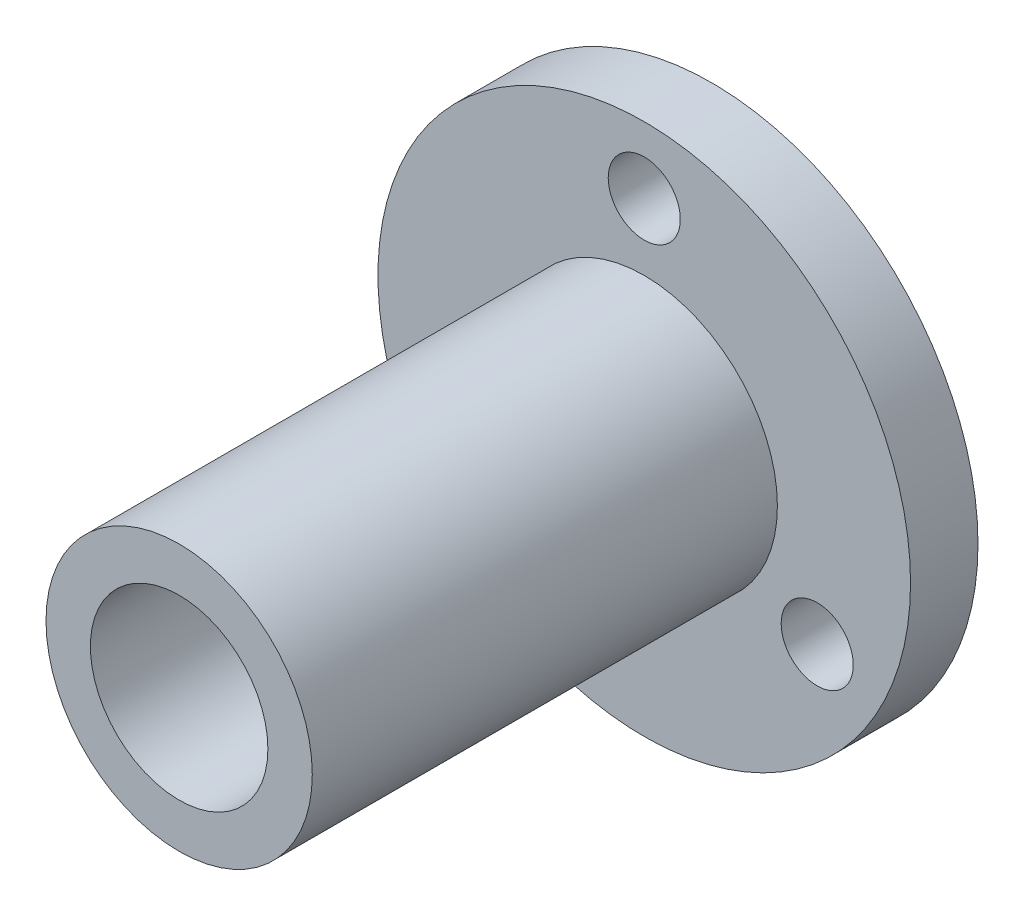
ISO-10303-21;
HEADER;
FILE_DESCRIPTION(('STEP AP214'),'2;1');
FILE_NAME('part.step','',(''),(''),'','','');
FILE_SCHEMA(('AUTOMOTIVE_DESIGN { 1 0 10303 214 1 1 1 1 }'));
ENDSEC;
DATA;
#1=APPLICATION_CONTEXT('core data for automotive mechanical design processes');
#2=APPLICATION_PROTOCOL_DEFINITION('international standard','automotive_design',2000,#1);
#3=PRODUCT_CONTEXT('',#1,'mechanical');
#4=PRODUCT('Part','Part','',(#3));
#5=PRODUCT_RELATED_PRODUCT_CATEGORY('part','',(#4));
#6=PRODUCT_DEFINITION_FORMATION('','',#4);
#7=PRODUCT_DEFINITION_CONTEXT('part definition',#1,'design');
#8=PRODUCT_DEFINITION('design','',#6,#7);
#9=PRODUCT_DEFINITION_SHAPE('','',#8);
#10=(LENGTH_UNIT() NAMED_UNIT(*) SI_UNIT(.MILLI.,.METRE.));
#11=(NAMED_UNIT(*) PLANE_ANGLE_UNIT() SI_UNIT($,.RADIAN.));
#12=(NAMED_UNIT(*) SI_UNIT($,.STERADIAN.) SOLID_ANGLE_UNIT());
#13=UNCERTAINTY_MEASURE_WITH_UNIT(LENGTH_MEASURE(1.E-05),#10,'distance_accuracy_value','');
#14=(GEOMETRIC_REPRESENTATION_CONTEXT(3) GLOBAL_UNCERTAINTY_ASSIGNED_CONTEXT((#13)) GLOBAL_UNIT_ASSIGNED_CONTEXT((#10,
#11,#12)) REPRESENTATION_CONTEXT('',''));
#15=CARTESIAN_POINT('',(0.,0.,0.));
#16=DIRECTION('',(0.,0.,1.));
#17=DIRECTION('',(1.,0.,0.));
#18=AXIS2_PLACEMENT_3D('',#15,#16,#17);
#19=CARTESIAN_POINT('',(0.,0.,0.));
#20=DIRECTION('',(0.,0.,1.));
#21=DIRECTION('',(1.,0.,0.));
#22=AXIS2_PLACEMENT_3D('',#19,#20,#21);
#23=PLANE('',#22);
#24=CARTESIAN_POINT('',(0.,0.,0.));
#25=DIRECTION('',(0.,0.,1.));
#26=DIRECTION('',(1.,0.,0.));
#27=AXIS2_PLACEMENT_3D('',#24,#25,#26);
#28=CIRCLE('',#27,6.35);
#29=CARTESIAN_POINT('',(6.35,0.,0.));
#30=VERTEX_POINT('',#29);
#31=EDGE_CURVE('E17',#30,#30,#28,.T.);
#32=ORIENTED_EDGE('',*,*,#31,.T.);
#33=EDGE_LOOP('',(#32));
#34=FACE_BOUND('',#33,.T.);
#35=CARTESIAN_POINT('',(12.3733379565702,-7.14375,0.));
#36=DIRECTION('',(0.,0.,-1.));
#37=DIRECTION('',(-1.,0.,0.));
#38=AXIS2_PLACEMENT_3D('',#35,#36,#37);
#39=CIRCLE('',#38,2.5781);
#40=CARTESIAN_POINT('',(9.79523795657016,-7.14375,0.));
#41=VERTEX_POINT('',#40);
#42=EDGE_CURVE('E43',#41,#41,#39,.F.);
#43=ORIENTED_EDGE('',*,*,#42,.T.);
#44=EDGE_LOOP('',(#43));
#45=FACE_BOUND('',#44,.T.);
#46=CARTESIAN_POINT('',(-12.3733379565702,-7.14375,0.));
#47=DIRECTION('',(0.,0.,-1.));
#48=DIRECTION('',(-1.,0.,0.));
#49=AXIS2_PLACEMENT_3D('',#46,#47,#48);
#50=CIRCLE('',#49,2.5781);
#51=CARTESIAN_POINT('',(-14.9514379565702,-7.14375,0.));
#52=VERTEX_POINT('',#51);
#53=EDGE_CURVE('E46',#52,#52,#50,.F.);
#54=ORIENTED_EDGE('',*,*,#53,.T.);
#55=EDGE_LOOP('',(#54));
#56=FACE_BOUND('',#55,.T.);
#57=CARTESIAN_POINT('',(0.,14.2875,0.));
#58=DIRECTION('',(0.,0.,-1.));
#59=DIRECTION('',(-1.,0.,0.));
#60=AXIS2_PLACEMENT_3D('',#57,#58,#59);
#61=CIRCLE('',#60,2.5781);
#62=CARTESIAN_POINT('',(-2.5781,14.2875,0.));
#63=VERTEX_POINT('',#62);
#64=EDGE_CURVE('E49',#63,#63,#61,.F.);
#65=ORIENTED_EDGE('',*,*,#64,.T.);
#66=EDGE_LOOP('',(#65));
#67=FACE_BOUND('',#66,.T.);
#68=CARTESIAN_POINT('',(0.,0.,0.));
#69=DIRECTION('',(0.,0.,1.));
#70=DIRECTION('',(1.,0.,0.));
#71=AXIS2_PLACEMENT_3D('',#68,#69,#70);
#72=CIRCLE('',#71,19.05);
#73=CARTESIAN_POINT('',(19.05,0.,0.));
#74=VERTEX_POINT('',#73);
#75=EDGE_CURVE('E51',#74,#74,#72,.T.);
#76=ORIENTED_EDGE('',*,*,#75,.F.);
#77=EDGE_LOOP('',(#76));
#78=FACE_BOUND('',#77,.T.);
#79=ADVANCED_FACE('F14',(#34,#45,#56,#67,#78),#23,.F.);
#80=CARTESIAN_POINT('',(0.,0.,38.1));
#81=DIRECTION('',(0.,0.,1.));
#82=DIRECTION('',(1.,0.,0.));
#83=AXIS2_PLACEMENT_3D('',#80,#81,#82);
#84=CYLINDRICAL_SURFACE('',#83,6.35);
#85=CARTESIAN_POINT('',(0.,0.,38.1));
#86=DIRECTION('',(0.,0.,1.));
#87=DIRECTION('',(1.,0.,0.));
#88=AXIS2_PLACEMENT_3D('',#85,#86,#87);
#89=CIRCLE('',#88,6.35);
#90=CARTESIAN_POINT('',(6.35,0.,38.1));
#91=VERTEX_POINT('',#90);
#92=EDGE_CURVE('E40',#91,#91,#89,.F.);
#93=ORIENTED_EDGE('',*,*,#92,.F.);
#94=EDGE_LOOP('',(#93));
#95=FACE_BOUND('',#94,.T.);
#96=ORIENTED_EDGE('',*,*,#31,.F.);
#97=EDGE_LOOP('',(#96));
#98=FACE_BOUND('',#97,.T.);
#99=ADVANCED_FACE('F60',(#95,#98),#84,.F.);
#100=CARTESIAN_POINT('',(0.,0.,0.));
#101=DIRECTION('',(0.,0.,1.));
#102=DIRECTION('',(1.,0.,0.));
#103=AXIS2_PLACEMENT_3D('',#100,#101,#102);
#104=CYLINDRICAL_SURFACE('',#103,19.05);
#105=CARTESIAN_POINT('',(0.,0.,4.826));
#106=DIRECTION('',(0.,0.,1.));
#107=DIRECTION('',(1.,0.,0.));
#108=AXIS2_PLACEMENT_3D('',#105,#106,#107);
#109=CIRCLE('',#108,19.05);
#110=CARTESIAN_POINT('',(19.05,0.,4.826));
#111=VERTEX_POINT('',#110);
#112=EDGE_CURVE('E37',#111,#111,#109,.T.);
#113=ORIENTED_EDGE('',*,*,#112,.F.);
#114=EDGE_LOOP('',(#113));
#115=FACE_BOUND('',#114,.T.);
#116=ORIENTED_EDGE('',*,*,#75,.T.);
#117=EDGE_LOOP('',(#116));
#118=FACE_BOUND('',#117,.T.);
#119=ADVANCED_FACE('F62',(#115,#118),#104,.T.);
#120=CARTESIAN_POINT('',(0.,14.2875,0.));
#121=DIRECTION('',(0.,0.,-1.));
#122=DIRECTION('',(-1.,0.,0.));
#123=AXIS2_PLACEMENT_3D('',#120,#121,#122);
#124=CYLINDRICAL_SURFACE('',#123,2.5781);
#125=CARTESIAN_POINT('',(0.,14.2875,4.826));
#126=DIRECTION('',(0.,0.,-1.));
#127=DIRECTION('',(-1.,0.,0.));
#128=AXIS2_PLACEMENT_3D('',#125,#126,#127);
#129=CIRCLE('',#128,2.5781);
#130=CARTESIAN_POINT('',(-2.5781,14.2875,4.826));
#131=VERTEX_POINT('',#130);
#132=EDGE_CURVE('E34',#131,#131,#129,.T.);
#133=ORIENTED_EDGE('',*,*,#132,.F.);
#134=EDGE_LOOP('',(#133));
#135=FACE_BOUND('',#134,.T.);
#136=ORIENTED_EDGE('',*,*,#64,.F.);
#137=EDGE_LOOP('',(#136));
#138=FACE_BOUND('',#137,.T.);
#139=ADVANCED_FACE('F69',(#135,#138),#124,.F.);
#140=CARTESIAN_POINT('',(-12.3733379565702,-7.14375,0.));
#141=DIRECTION('',(0.,0.,-1.));
#142=DIRECTION('',(-1.,0.,0.));
#143=AXIS2_PLACEMENT_3D('',#140,#141,#142);
#144=CYLINDRICAL_SURFACE('',#143,2.5781);
#145=CARTESIAN_POINT('',(-12.3733379565702,-7.14375,4.826));
#146=DIRECTION('',(0.,0.,-1.));
#147=DIRECTION('',(-1.,0.,0.));
#148=AXIS2_PLACEMENT_3D('',#145,#146,#147);
#149=CIRCLE('',#148,2.5781);
#150=CARTESIAN_POINT('',(-14.9514379565702,-7.14375,4.826));
#151=VERTEX_POINT('',#150);
#152=EDGE_CURVE('E31',#151,#151,#149,.T.);
#153=ORIENTED_EDGE('',*,*,#152,.F.);
#154=EDGE_LOOP('',(#153));
#155=FACE_BOUND('',#154,.T.);
#156=ORIENTED_EDGE('',*,*,#53,.F.);
#157=EDGE_LOOP('',(#156));
#158=FACE_BOUND('',#157,.T.);
#159=ADVANCED_FACE('F91',(#155,#158),#144,.F.);
#160=CARTESIAN_POINT('',(12.3733379565702,-7.14375,0.));
#161=DIRECTION('',(0.,0.,-1.));
#162=DIRECTION('',(-1.,0.,0.));
#163=AXIS2_PLACEMENT_3D('',#160,#161,#162);
#164=CYLINDRICAL_SURFACE('',#163,2.5781);
#165=CARTESIAN_POINT('',(12.3733379565702,-7.14375,4.826));
#166=DIRECTION('',(0.,0.,-1.));
#167=DIRECTION('',(-1.,0.,0.));
#168=AXIS2_PLACEMENT_3D('',#165,#166,#167);
#169=CIRCLE('',#168,2.5781);
#170=CARTESIAN_POINT('',(9.79523795657016,-7.14375,4.826));
#171=VERTEX_POINT('',#170);
#172=EDGE_CURVE('E26',#171,#171,#169,.T.);
#173=ORIENTED_EDGE('',*,*,#172,.F.);
#174=EDGE_LOOP('',(#173));
#175=FACE_BOUND('',#174,.T.);
#176=ORIENTED_EDGE('',*,*,#42,.F.);
#177=EDGE_LOOP('',(#176));
#178=FACE_BOUND('',#177,.T.);
#179=ADVANCED_FACE('F87',(#175,#178),#164,.F.);
#180=CARTESIAN_POINT('',(0.,0.,38.1));
#181=DIRECTION('',(0.,0.,1.));
#182=DIRECTION('',(1.,0.,0.));
#183=AXIS2_PLACEMENT_3D('',#180,#181,#182);
#184=PLANE('',#183);
#185=ORIENTED_EDGE('',*,*,#92,.T.);
#186=EDGE_LOOP('',(#185));
#187=FACE_BOUND('',#186,.T.);
#188=CARTESIAN_POINT('',(0.,0.,38.1));
#189=DIRECTION('',(0.,0.,1.));
#190=DIRECTION('',(1.,0.,0.));
#191=AXIS2_PLACEMENT_3D('',#188,#189,#190);
#192=CIRCLE('',#191,9.525);
#193=CARTESIAN_POINT('',(9.525,0.,38.1));
#194=VERTEX_POINT('',#193);
#195=EDGE_CURVE('E21',#194,#194,#192,.F.);
#196=ORIENTED_EDGE('',*,*,#195,.F.);
#197=EDGE_LOOP('',(#196));
#198=FACE_BOUND('',#197,.T.);
#199=ADVANCED_FACE('F81',(#187,#198),#184,.T.);
#200=CARTESIAN_POINT('',(0.,0.,4.826));
#201=DIRECTION('',(0.,0.,1.));
#202=DIRECTION('',(1.,0.,0.));
#203=AXIS2_PLACEMENT_3D('',#200,#201,#202);
#204=PLANE('',#203);
#205=ORIENTED_EDGE('',*,*,#172,.T.);
#206=EDGE_LOOP('',(#205));
#207=FACE_BOUND('',#206,.T.);
#208=ORIENTED_EDGE('',*,*,#152,.T.);
#209=EDGE_LOOP('',(#208));
#210=FACE_BOUND('',#209,.T.);
#211=ORIENTED_EDGE('',*,*,#132,.T.);
#212=EDGE_LOOP('',(#211));
#213=FACE_BOUND('',#212,.T.);
#214=CARTESIAN_POINT('',(0.,0.,4.826));
#215=DIRECTION('',(0.,0.,1.));
#216=DIRECTION('',(1.,0.,0.));
#217=AXIS2_PLACEMENT_3D('',#214,#215,#216);
#218=CIRCLE('',#217,9.525);
#219=CARTESIAN_POINT('',(9.525,0.,4.826));
#220=VERTEX_POINT('',#219);
#221=EDGE_CURVE('E10',#220,#220,#218,.T.);
#222=ORIENTED_EDGE('',*,*,#221,.F.);
#223=EDGE_LOOP('',(#222));
#224=FACE_BOUND('',#223,.T.);
#225=ORIENTED_EDGE('',*,*,#112,.T.);
#226=EDGE_LOOP('',(#225));
#227=FACE_BOUND('',#226,.T.);
#228=ADVANCED_FACE('F75',(#207,#210,#213,#224,#227),#204,.T.);
#229=CARTESIAN_POINT('',(0.,0.,4.826));
#230=DIRECTION('',(0.,0.,1.));
#231=DIRECTION('',(1.,0.,0.));
#232=AXIS2_PLACEMENT_3D('',#229,#230,#231);
#233=CYLINDRICAL_SURFACE('',#232,9.525);
#234=ORIENTED_EDGE('',*,*,#195,.T.);
#235=EDGE_LOOP('',(#234));
#236=FACE_BOUND('',#235,.T.);
#237=ORIENTED_EDGE('',*,*,#221,.T.);
#238=EDGE_LOOP('',(#237));
#239=FACE_BOUND('',#238,.T.);
#240=ADVANCED_FACE('F73',(#236,#239),#233,.T.);
#241=CLOSED_SHELL('',(#79,#99,#119,#139,#159,#179,#199,#228,#240));
#242=MANIFOLD_SOLID_BREP('B1',#241);
#243=ADVANCED_BREP_SHAPE_REPRESENTATION('',(#18,#242),#14);
#244=SHAPE_DEFINITION_REPRESENTATION(#9,#243);
ENDSEC;
END-ISO-10303-21;
